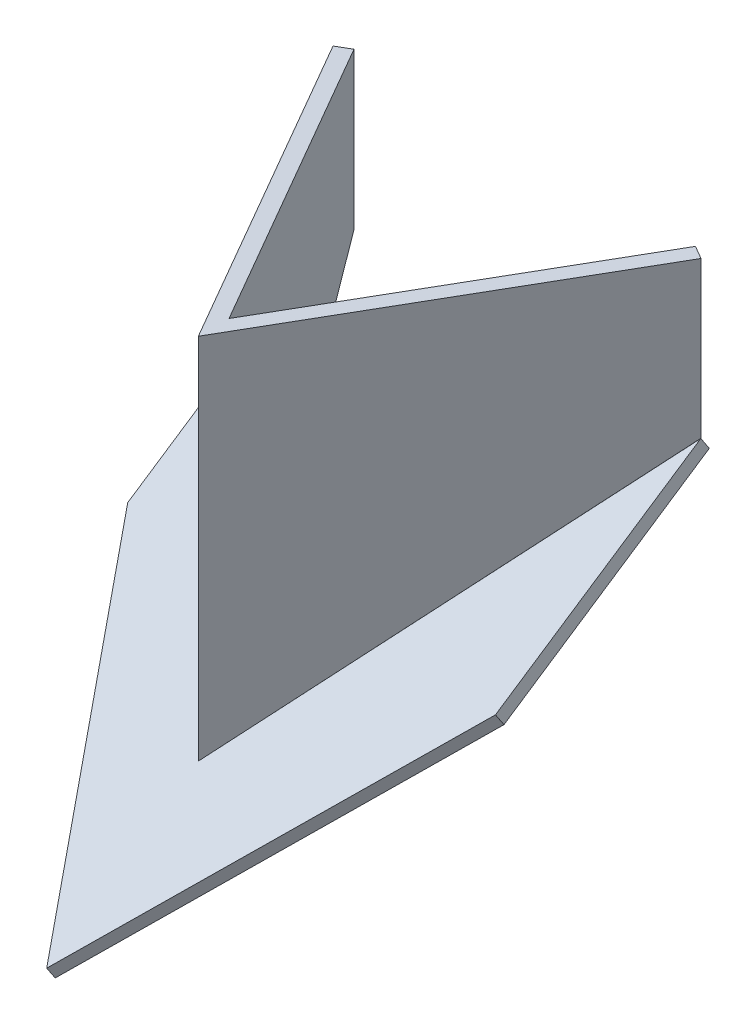
ISO-10303-21;
HEADER;
FILE_DESCRIPTION(('STEP AP214'),'2;1');
FILE_NAME('part.step','',(''),(''),'','','');
FILE_SCHEMA(('AUTOMOTIVE_DESIGN { 1 0 10303 214 1 1 1 1 }'));
ENDSEC;
DATA;
#1=APPLICATION_CONTEXT('core data for automotive mechanical design processes');
#2=APPLICATION_PROTOCOL_DEFINITION('international standard','automotive_design',2000,#1);
#3=PRODUCT_CONTEXT('',#1,'mechanical');
#4=PRODUCT('Part','Part','',(#3));
#5=PRODUCT_RELATED_PRODUCT_CATEGORY('part','',(#4));
#6=PRODUCT_DEFINITION_FORMATION('','',#4);
#7=PRODUCT_DEFINITION_CONTEXT('part definition',#1,'design');
#8=PRODUCT_DEFINITION('design','',#6,#7);
#9=PRODUCT_DEFINITION_SHAPE('','',#8);
#10=(LENGTH_UNIT() NAMED_UNIT(*) SI_UNIT(.MILLI.,.METRE.));
#11=(NAMED_UNIT(*) PLANE_ANGLE_UNIT() SI_UNIT($,.RADIAN.));
#12=(NAMED_UNIT(*) SI_UNIT($,.STERADIAN.) SOLID_ANGLE_UNIT());
#13=UNCERTAINTY_MEASURE_WITH_UNIT(LENGTH_MEASURE(1.E-05),#10,'distance_accuracy_value','');
#14=(GEOMETRIC_REPRESENTATION_CONTEXT(3) GLOBAL_UNCERTAINTY_ASSIGNED_CONTEXT((#13)) GLOBAL_UNIT_ASSIGNED_CONTEXT((#10,
#11,#12)) REPRESENTATION_CONTEXT('',''));
#15=CARTESIAN_POINT('',(0.,0.,0.));
#16=DIRECTION('',(0.,0.,1.));
#17=DIRECTION('',(1.,0.,0.));
#18=AXIS2_PLACEMENT_3D('',#15,#16,#17);
#19=CARTESIAN_POINT('',(0.00709387910028006,-5.28626521092144,-3.5182168490133));
#20=DIRECTION('',(0.901238732850657,-0.239243859388204,0.361290910700477));
#21=DIRECTION('',(0.372096782502334,0.,-0.928193936874946));
#22=AXIS2_PLACEMENT_3D('',#19,#20,#21);
#23=PLANE('',#22);
#24=DIRECTION('',(0.433321472343402,0.499734842352616,-0.749998392628246));
#25=VECTOR('',#24,1.);
#26=CARTESIAN_POINT('',(0.,0.,0.));
#27=LINE('',#26,#25);
#28=CARTESIAN_POINT('',(0.,0.,0.));
#29=VERTEX_POINT('',#28);
#30=CARTESIAN_POINT('',(76.1999999999997,87.8788553480485,-131.887942707306));
#31=VERTEX_POINT('',#30);
#32=EDGE_CURVE('E130',#29,#31,#27,.T.);
#33=ORIENTED_EDGE('',*,*,#32,.T.);
#34=DIRECTION('',(-0.00111714631500473,0.832482710381328,0.554049897482409));
#35=VECTOR('',#34,1.);
#36=CARTESIAN_POINT('',(76.2070938791,82.5925901371271,-135.406159556319));
#37=LINE('',#36,#35);
#38=CARTESIAN_POINT('',(76.2070938791,82.5925901371271,-135.406159556319));
#39=VERTEX_POINT('',#38);
#40=EDGE_CURVE('E12',#39,#31,#37,.T.);
#41=ORIENTED_EDGE('',*,*,#40,.F.);
#42=DIRECTION('',(0.433321472343402,0.499734842352616,-0.749998392628246));
#43=VECTOR('',#42,1.);
#44=CARTESIAN_POINT('',(0.00709387910028006,-5.28626521092144,-3.5182168490133));
#45=LINE('',#44,#43);
#46=CARTESIAN_POINT('',(0.00709387910028006,-5.28626521092144,-3.5182168490133));
#47=VERTEX_POINT('',#46);
#48=EDGE_CURVE('E142',#47,#39,#45,.T.);
#49=ORIENTED_EDGE('',*,*,#48,.F.);
#50=DIRECTION('',(-0.00111714631500473,0.832482710381328,0.554049897482409));
#51=VECTOR('',#50,1.);
#52=CARTESIAN_POINT('',(0.00709387910028006,-5.28626521092144,-3.5182168490133));
#53=LINE('',#52,#51);
#54=EDGE_CURVE('E126',#47,#29,#53,.T.);
#55=ORIENTED_EDGE('',*,*,#54,.T.);
#56=EDGE_LOOP('',(#33,#41,#49,#55));
#57=FACE_BOUND('',#56,.T.);
#58=ADVANCED_FACE('F47',(#57),#23,.F.);
#59=CARTESIAN_POINT('',(76.2070938791,82.5925901371271,-135.406159556319));
#60=DIRECTION('',(-0.999999375991861,-0.000930005572538701,-0.000618955187534298));
#61=DIRECTION('',(0.000930005750683888,-0.999999567544558,0.));
#62=AXIS2_PLACEMENT_3D('',#59,#60,#61);
#63=PLANE('',#62);
#64=DIRECTION('',(0.,-0.55405024321427,0.83248322985764));
#65=VECTOR('',#64,1.);
#66=CARTESIAN_POINT('',(76.1999999999997,87.8788553480485,-131.887942707306));
#67=LINE('',#66,#65);
#68=CARTESIAN_POINT('',(76.1999999999997,31.2852731012147,-46.8537626576136));
#69=VERTEX_POINT('',#68);
#70=EDGE_CURVE('E134',#31,#69,#67,.T.);
#71=ORIENTED_EDGE('',*,*,#70,.T.);
#72=DIRECTION('',(-0.00111714631500473,0.832482710381328,0.554049897482409));
#73=VECTOR('',#72,1.);
#74=CARTESIAN_POINT('',(76.2070938791,25.9990078902933,-50.3719795066269));
#75=LINE('',#74,#73);
#76=CARTESIAN_POINT('',(76.2070938791,25.9990078902933,-50.3719795066269));
#77=VERTEX_POINT('',#76);
#78=EDGE_CURVE('E55',#77,#69,#75,.T.);
#79=ORIENTED_EDGE('',*,*,#78,.F.);
#80=DIRECTION('',(0.,-0.55405024321427,0.83248322985764));
#81=VECTOR('',#80,1.);
#82=CARTESIAN_POINT('',(76.2070938791,82.5925901371271,-135.406159556319));
#83=LINE('',#82,#81);
#84=EDGE_CURVE('E96',#39,#77,#83,.T.);
#85=ORIENTED_EDGE('',*,*,#84,.F.);
#86=ORIENTED_EDGE('',*,*,#40,.T.);
#87=EDGE_LOOP('',(#71,#79,#85,#86));
#88=FACE_BOUND('',#87,.T.);
#89=ADVANCED_FACE('F166',(#88),#63,.F.);
#90=CARTESIAN_POINT('',(76.2070938791,25.9990078902933,-50.3719795066269));
#91=DIRECTION('',(-0.868703036801883,0.273631084700251,-0.412893525423868));
#92=DIRECTION('',(-0.429277002212649,0.,0.903172882327255));
#93=AXIS2_PLACEMENT_3D('',#90,#91,#92);
#94=PLANE('',#93);
#95=DIRECTION('',(-0.495331995569939,-0.481766090963157,0.722874572635379));
#96=VECTOR('',#95,1.);
#97=CARTESIAN_POINT('',(76.1999999999997,31.2852731012147,-46.8537626576136));
#98=LINE('',#97,#96);
#99=CARTESIAN_POINT('',(0.626923850211377,-42.2180454898893,63.4356101531636));
#100=VERTEX_POINT('',#99);
#101=EDGE_CURVE('E136',#69,#100,#98,.T.);
#102=ORIENTED_EDGE('',*,*,#101,.T.);
#103=DIRECTION('',(-0.00111714631500473,0.832482710381328,0.554049897482409));
#104=VECTOR('',#103,1.);
#105=CARTESIAN_POINT('',(0.634017729311657,-47.5043107008108,59.9173933041503));
#106=LINE('',#105,#104);
#107=CARTESIAN_POINT('',(0.634017729311657,-47.5043107008108,59.9173933041503));
#108=VERTEX_POINT('',#107);
#109=EDGE_CURVE('E122',#108,#100,#106,.T.);
#110=ORIENTED_EDGE('',*,*,#109,.F.);
#111=DIRECTION('',(-0.495331995569939,-0.481766090963157,0.722874572635379));
#112=VECTOR('',#111,1.);
#113=CARTESIAN_POINT('',(76.2070938791,25.9990078902933,-50.3719795066269));
#114=LINE('',#113,#112);
#115=EDGE_CURVE('E109',#77,#108,#114,.T.);
#116=ORIENTED_EDGE('',*,*,#115,.F.);
#117=ORIENTED_EDGE('',*,*,#78,.T.);
#118=EDGE_LOOP('',(#102,#110,#116,#117));
#119=FACE_BOUND('',#118,.T.);
#120=ADVANCED_FACE('F148',(#119),#94,.F.);
#121=CARTESIAN_POINT('',(0.634017729311657,-47.5043107008108,59.9173933041503));
#122=DIRECTION('',(0.865159259860783,0.278658740489786,-0.416951749517601));
#123=DIRECTION('',(-0.434148282934875,0.,-0.900841422462744));
#124=AXIS2_PLACEMENT_3D('',#121,#122,#123);
#125=PLANE('',#124);
#126=DIRECTION('',(-0.501495969137593,0.478875603121315,-0.720541428145491));
#127=VECTOR('',#126,1.);
#128=CARTESIAN_POINT('',(0.626923850211377,-42.2180454898893,63.4356101531636));
#129=LINE('',#128,#127);
#130=CARTESIAN_POINT('',(-76.2000000000007,31.1435401635173,-46.9480914870558));
#131=VERTEX_POINT('',#130);
#132=EDGE_CURVE('E118',#100,#131,#129,.T.);
#133=ORIENTED_EDGE('',*,*,#132,.T.);
#134=DIRECTION('',(-0.00111714631500473,0.832482710381328,0.554049897482409));
#135=VECTOR('',#134,1.);
#136=CARTESIAN_POINT('',(-76.1929061209004,25.8572749525959,-50.4663083360691));
#137=LINE('',#136,#135);
#138=CARTESIAN_POINT('',(-76.1929061209004,25.8572749525959,-50.4663083360691));
#139=VERTEX_POINT('',#138);
#140=EDGE_CURVE('E115',#139,#131,#137,.T.);
#141=ORIENTED_EDGE('',*,*,#140,.F.);
#142=DIRECTION('',(-0.501495969137593,0.478875603121315,-0.720541428145491));
#143=VECTOR('',#142,1.);
#144=CARTESIAN_POINT('',(0.634017729311657,-47.5043107008108,59.9173933041503));
#145=LINE('',#144,#143);
#146=EDGE_CURVE('E103',#108,#139,#145,.T.);
#147=ORIENTED_EDGE('',*,*,#146,.F.);
#148=ORIENTED_EDGE('',*,*,#109,.T.);
#149=EDGE_LOOP('',(#133,#141,#147,#148));
#150=FACE_BOUND('',#149,.T.);
#151=ADVANCED_FACE('F116',(#150),#125,.F.);
#152=CARTESIAN_POINT('',(-76.1929061209004,82.4508571994297,-135.500488385762));
#153=DIRECTION('',(-0.999999375991861,-0.000930005572538626,-0.000618955187534412));
#154=DIRECTION('',(0.000930005750683813,-0.999999567544558,0.));
#155=AXIS2_PLACEMENT_3D('',#152,#153,#154);
#156=PLANE('',#155);
#157=DIRECTION('',(0.,-0.55405024321427,0.83248322985764));
#158=VECTOR('',#157,1.);
#159=CARTESIAN_POINT('',(-76.2000000000007,87.7371224103511,-131.982271536748));
#160=LINE('',#159,#158);
#161=CARTESIAN_POINT('',(-76.2000000000007,87.7371224103511,-131.982271536748));
#162=VERTEX_POINT('',#161);
#163=EDGE_CURVE('E139',#162,#131,#160,.T.);
#164=ORIENTED_EDGE('',*,*,#163,.F.);
#165=DIRECTION('',(-0.00111714631500473,0.832482710381328,0.554049897482409));
#166=VECTOR('',#165,1.);
#167=CARTESIAN_POINT('',(-76.1929061209004,82.4508571994297,-135.500488385762));
#168=LINE('',#167,#166);
#169=CARTESIAN_POINT('',(-76.1929061209004,82.4508571994297,-135.500488385762));
#170=VERTEX_POINT('',#169);
#171=EDGE_CURVE('E85',#170,#162,#168,.T.);
#172=ORIENTED_EDGE('',*,*,#171,.F.);
#173=DIRECTION('',(0.,-0.55405024321427,0.83248322985764));
#174=VECTOR('',#173,1.);
#175=CARTESIAN_POINT('',(-76.1929061209004,82.4508571994297,-135.500488385762));
#176=LINE('',#175,#174);
#177=EDGE_CURVE('E107',#170,#139,#176,.T.);
#178=ORIENTED_EDGE('',*,*,#177,.T.);
#179=ORIENTED_EDGE('',*,*,#140,.T.);
#180=EDGE_LOOP('',(#164,#172,#178,#179));
#181=FACE_BOUND('',#180,.T.);
#182=ADVANCED_FACE('F124',(#181),#156,.T.);
#183=CARTESIAN_POINT('',(-76.1929061209004,82.4508571994297,-135.500488385762));
#184=DIRECTION('',(-0.901238732850654,-0.240920174521719,0.360175257226494));
#185=DIRECTION('',(0.37110621517362,0.,0.928590424815759));
#186=AXIS2_PLACEMENT_3D('',#183,#184,#185);
#187=PLANE('',#186);
#188=DIRECTION('',(0.433321472343407,-0.498928859081715,0.750534806109324));
#189=VECTOR('',#188,1.);
#190=CARTESIAN_POINT('',(-76.2000000000007,87.7371224103511,-131.982271536748));
#191=LINE('',#190,#189);
#192=EDGE_CURVE('E88',#162,#29,#191,.T.);
#193=ORIENTED_EDGE('',*,*,#192,.T.);
#194=ORIENTED_EDGE('',*,*,#54,.F.);
#195=DIRECTION('',(0.433321472343407,-0.498928859081715,0.750534806109324));
#196=VECTOR('',#195,1.);
#197=CARTESIAN_POINT('',(-76.1929061209004,82.4508571994297,-135.500488385762));
#198=LINE('',#197,#196);
#199=EDGE_CURVE('E63',#170,#47,#198,.T.);
#200=ORIENTED_EDGE('',*,*,#199,.F.);
#201=ORIENTED_EDGE('',*,*,#171,.T.);
#202=EDGE_LOOP('',(#193,#194,#200,#201));
#203=FACE_BOUND('',#202,.T.);
#204=ADVANCED_FACE('F155',(#203),#187,.F.);
#205=CARTESIAN_POINT('',(0.00709387910028007,-5.28626521092144,-3.5182168490133));
#206=DIRECTION('',(-0.00111714631500474,0.832482710381329,0.554049897482409));
#207=DIRECTION('',(0.,-0.55405024321427,0.83248322985764));
#208=AXIS2_PLACEMENT_3D('',#205,#206,#207);
#209=PLANE('',#208);
#210=ORIENTED_EDGE('',*,*,#48,.T.);
#211=ORIENTED_EDGE('',*,*,#84,.T.);
#212=ORIENTED_EDGE('',*,*,#115,.T.);
#213=ORIENTED_EDGE('',*,*,#146,.T.);
#214=ORIENTED_EDGE('',*,*,#177,.F.);
#215=ORIENTED_EDGE('',*,*,#199,.T.);
#216=EDGE_LOOP('',(#210,#211,#212,#213,#214,#215));
#217=FACE_BOUND('',#216,.T.);
#218=ADVANCED_FACE('F105',(#217),#209,.F.);
#219=CARTESIAN_POINT('',(0.,0.,0.));
#220=DIRECTION('',(-0.00111714631500474,0.832482710381329,0.554049897482409));
#221=DIRECTION('',(0.,-0.55405024321427,0.83248322985764));
#222=AXIS2_PLACEMENT_3D('',#219,#220,#221);
#223=PLANE('',#222);
#224=ORIENTED_EDGE('',*,*,#32,.F.);
#225=ORIENTED_EDGE('',*,*,#192,.F.);
#226=ORIENTED_EDGE('',*,*,#163,.T.);
#227=ORIENTED_EDGE('',*,*,#132,.F.);
#228=ORIENTED_EDGE('',*,*,#101,.F.);
#229=ORIENTED_EDGE('',*,*,#70,.F.);
#230=EDGE_LOOP('',(#224,#225,#226,#227,#228,#229));
#231=FACE_BOUND('',#230,.T.);
#232=ADVANCED_FACE('F151',(#231),#223,.T.);
#233=CLOSED_SHELL('',(#58,#89,#120,#151,#182,#204,#218,#232));
#234=MANIFOLD_SOLID_BREP('B2',#233);
#235=CARTESIAN_POINT('',(5.49926131403117,152.4,-3.17500000000003));
#236=DIRECTION('',(-0.866025403784436,0.,0.500000000000004));
#237=DIRECTION('',(0.500000000000004,0.,0.866025403784436));
#238=AXIS2_PLACEMENT_3D('',#235,#236,#237);
#239=PLANE('',#238);
#240=DIRECTION('',(0.480404005554627,-0.277214656517828,0.832084145780205));
#241=VECTOR('',#240,1.);
#242=CARTESIAN_POINT('',(-14.3740064244245,14.6410871785996,-37.5965094354242));
#243=LINE('',#242,#241);
#244=CARTESIAN_POINT('',(-0.0256971095831784,6.36146920636148,-12.7445086994055));
#245=VERTEX_POINT('',#244);
#246=CARTESIAN_POINT('',(0.,6.34664082165983,-12.7));
#247=VERTEX_POINT('',#246);
#248=EDGE_CURVE('E286',#245,#247,#243,.T.);
#249=ORIENTED_EDGE('',*,*,#248,.F.);
#250=DIRECTION('',(0.433321472343407,-0.498928859081716,0.750534806109324));
#251=VECTOR('',#250,1.);
#252=CARTESIAN_POINT('',(-27.4490986685032,37.9369329791064,-60.243233515818));
#253=LINE('',#252,#251);
#254=CARTESIAN_POINT('',(-70.7007386859695,87.7371224103512,-135.157271536748));
#255=VERTEX_POINT('',#254);
#256=EDGE_CURVE('E239',#255,#245,#253,.T.);
#257=ORIENTED_EDGE('',*,*,#256,.F.);
#258=DIRECTION('',(0.,-1.,0.));
#259=VECTOR('',#258,1.);
#260=CARTESIAN_POINT('',(-70.7007386859695,152.4,-135.157271536748));
#261=LINE('',#260,#259);
#262=CARTESIAN_POINT('',(-70.7007386859695,152.4,-135.157271536748));
#263=VERTEX_POINT('',#262);
#264=EDGE_CURVE('E232',#263,#255,#261,.T.);
#265=ORIENTED_EDGE('',*,*,#264,.F.);
#266=DIRECTION('',(-0.500000000000004,0.,-0.866025403784436));
#267=VECTOR('',#266,1.);
#268=CARTESIAN_POINT('',(5.49926131403117,152.4,-3.17500000000003));
#269=LINE('',#268,#267);
#270=CARTESIAN_POINT('',(0.,152.4,-12.7));
#271=VERTEX_POINT('',#270);
#272=EDGE_CURVE('E332',#271,#263,#269,.T.);
#273=ORIENTED_EDGE('',*,*,#272,.F.);
#274=DIRECTION('',(0.,-1.,0.));
#275=VECTOR('',#274,1.);
#276=CARTESIAN_POINT('',(0.,152.4,-12.7));
#277=LINE('',#276,#275);
#278=EDGE_CURVE('E305',#271,#247,#277,.T.);
#279=ORIENTED_EDGE('',*,*,#278,.T.);
#280=EDGE_LOOP('',(#249,#257,#265,#273,#279));
#281=FACE_BOUND('',#280,.T.);
#282=ADVANCED_FACE('F225',(#281),#239,.F.);
#283=CARTESIAN_POINT('',(0.,152.4,0.));
#284=DIRECTION('',(0.86602540378444,0.,0.499999999999998));
#285=DIRECTION('',(0.499999999999998,0.,-0.86602540378444));
#286=AXIS2_PLACEMENT_3D('',#283,#284,#285);
#287=PLANE('',#286);
#288=DIRECTION('',(0.,-1.,0.));
#289=VECTOR('',#288,1.);
#290=CARTESIAN_POINT('',(0.,152.4,0.));
#291=LINE('',#290,#289);
#292=CARTESIAN_POINT('',(0.,152.4,0.));
#293=VERTEX_POINT('',#292);
#294=CARTESIAN_POINT('',(0.,0.,0.));
#295=VERTEX_POINT('',#294);
#296=EDGE_CURVE('E307',#293,#295,#291,.T.);
#297=ORIENTED_EDGE('',*,*,#296,.T.);
#298=DIRECTION('',(0.433069964514898,0.499801583971332,-0.750099181771859));
#299=VECTOR('',#298,1.);
#300=CARTESIAN_POINT('',(32.9868358654071,38.0697673970544,-57.1348756998207));
#301=LINE('',#300,#299);
#302=CARTESIAN_POINT('',(76.1999999999997,87.9416348840445,-131.982271536749));
#303=VERTEX_POINT('',#302);
#304=EDGE_CURVE('E300',#295,#303,#301,.T.);
#305=ORIENTED_EDGE('',*,*,#304,.T.);
#306=DIRECTION('',(0.,-1.,0.));
#307=VECTOR('',#306,1.);
#308=CARTESIAN_POINT('',(76.1999999999997,152.4,-131.982271536749));
#309=LINE('',#308,#307);
#310=CARTESIAN_POINT('',(76.1999999999997,152.4,-131.982271536749));
#311=VERTEX_POINT('',#310);
#312=EDGE_CURVE('E299',#311,#303,#309,.T.);
#313=ORIENTED_EDGE('',*,*,#312,.F.);
#314=DIRECTION('',(-0.499999999999998,0.,0.86602540378444));
#315=VECTOR('',#314,1.);
#316=CARTESIAN_POINT('',(0.,152.4,0.));
#317=LINE('',#316,#315);
#318=EDGE_CURVE('E338',#311,#293,#317,.T.);
#319=ORIENTED_EDGE('',*,*,#318,.T.);
#320=EDGE_LOOP('',(#297,#305,#313,#319));
#321=FACE_BOUND('',#320,.T.);
#322=ADVANCED_FACE('F346',(#321),#287,.T.);
#323=CARTESIAN_POINT('',(70.7007386859685,152.4,-135.157271536749));
#324=DIRECTION('',(0.499999999999998,0.,-0.86602540378444));
#325=DIRECTION('',(-0.86602540378444,0.,-0.499999999999998));
#326=AXIS2_PLACEMENT_3D('',#323,#324,#325);
#327=PLANE('',#326);
#328=ORIENTED_EDGE('',*,*,#312,.T.);
#329=DIRECTION('',(0.86602540378444,0.,0.499999999999998));
#330=VECTOR('',#329,1.);
#331=CARTESIAN_POINT('',(-39.4748153285087,87.9416348840445,-198.767157305123));
#332=LINE('',#331,#330);
#333=CARTESIAN_POINT('',(70.7007386859685,87.9416348840445,-135.157271536749));
#334=VERTEX_POINT('',#333);
#335=EDGE_CURVE('E284',#334,#303,#332,.T.);
#336=ORIENTED_EDGE('',*,*,#335,.F.);
#337=DIRECTION('',(0.,-1.,0.));
#338=VECTOR('',#337,1.);
#339=CARTESIAN_POINT('',(70.7007386859685,152.4,-135.157271536749));
#340=LINE('',#339,#338);
#341=CARTESIAN_POINT('',(70.7007386859685,152.4,-135.157271536749));
#342=VERTEX_POINT('',#341);
#343=EDGE_CURVE('E297',#342,#334,#340,.T.);
#344=ORIENTED_EDGE('',*,*,#343,.F.);
#345=DIRECTION('',(0.86602540378444,0.,0.499999999999998));
#346=VECTOR('',#345,1.);
#347=CARTESIAN_POINT('',(70.7007386859685,152.4,-135.157271536749));
#348=LINE('',#347,#346);
#349=EDGE_CURVE('E341',#342,#311,#348,.T.);
#350=ORIENTED_EDGE('',*,*,#349,.T.);
#351=EDGE_LOOP('',(#328,#336,#344,#350));
#352=FACE_BOUND('',#351,.T.);
#353=ADVANCED_FACE('F295',(#352),#327,.T.);
#354=CARTESIAN_POINT('',(-5.49926131403119,152.4,-3.17499999999999));
#355=DIRECTION('',(0.86602540378444,0.,0.499999999999998));
#356=DIRECTION('',(0.499999999999998,0.,-0.86602540378444));
#357=AXIS2_PLACEMENT_3D('',#354,#355,#356);
#358=PLANE('',#357);
#359=DIRECTION('',(0.433069964514899,0.499801583971332,-0.750099181771859));
#360=VECTOR('',#359,1.);
#361=CARTESIAN_POINT('',(27.4875745513759,38.0697673970544,-60.3098756998207));
#362=LINE('',#361,#360);
#363=EDGE_CURVE('E281',#247,#334,#362,.T.);
#364=ORIENTED_EDGE('',*,*,#363,.F.);
#365=ORIENTED_EDGE('',*,*,#278,.F.);
#366=DIRECTION('',(-0.499999999999998,0.,0.86602540378444));
#367=VECTOR('',#366,1.);
#368=CARTESIAN_POINT('',(-5.49926131403119,152.4,-3.17499999999999));
#369=LINE('',#368,#367);
#370=EDGE_CURVE('E303',#342,#271,#369,.T.);
#371=ORIENTED_EDGE('',*,*,#370,.F.);
#372=ORIENTED_EDGE('',*,*,#343,.T.);
#373=EDGE_LOOP('',(#364,#365,#371,#372));
#374=FACE_BOUND('',#373,.T.);
#375=ADVANCED_FACE('F302',(#374),#358,.F.);
#376=CARTESIAN_POINT('',(-282.269406228435,0.,162.968317669985));
#377=DIRECTION('',(-0.24946442954086,-0.866642944686805,-0.432085066645951));
#378=DIRECTION('',(0.,0.446191886150516,-0.894937316650415));
#379=AXIS2_PLACEMENT_3D('',#376,#377,#378);
#380=PLANE('',#379);
#381=ORIENTED_EDGE('',*,*,#256,.T.);
#382=DIRECTION('',(0.00180406591212769,-0.446607028277284,0.894728398811347));
#383=VECTOR('',#382,1.);
#384=CARTESIAN_POINT('',(0.262136458598572,-64.8934077135768,130.0068541262));
#385=LINE('',#384,#383);
#386=EDGE_CURVE('E45',#245,#295,#385,.T.);
#387=ORIENTED_EDGE('',*,*,#386,.T.);
#388=DIRECTION('',(0.433321472343407,-0.498928859081716,0.750534806109324));
#389=VECTOR('',#388,1.);
#390=CARTESIAN_POINT('',(-32.9483599825343,37.9369329791063,-57.068233515818));
#391=LINE('',#390,#389);
#392=CARTESIAN_POINT('',(-76.2000000000007,87.7371224103512,-131.982271536748));
#393=VERTEX_POINT('',#392);
#394=EDGE_CURVE('E326',#393,#295,#391,.T.);
#395=ORIENTED_EDGE('',*,*,#394,.F.);
#396=DIRECTION('',(0.866025403784436,0.,-0.500000000000005));
#397=VECTOR('',#396,1.);
#398=CARTESIAN_POINT('',(-358.469406228436,87.7371224103512,30.9860461332367));
#399=LINE('',#398,#397);
#400=EDGE_CURVE('E246',#393,#255,#399,.T.);
#401=ORIENTED_EDGE('',*,*,#400,.T.);
#402=EDGE_LOOP('',(#381,#387,#395,#401));
#403=FACE_BOUND('',#402,.T.);
#404=ADVANCED_FACE('F324',(#403),#380,.T.);
#405=CARTESIAN_POINT('',(-76.2000000000007,152.4,-131.982271536748));
#406=DIRECTION('',(-0.500000000000006,0.,-0.866025403784435));
#407=DIRECTION('',(-0.866025403784435,0.,0.500000000000006));
#408=AXIS2_PLACEMENT_3D('',#405,#406,#407);
#409=PLANE('',#408);
#410=ORIENTED_EDGE('',*,*,#264,.T.);
#411=ORIENTED_EDGE('',*,*,#400,.F.);
#412=DIRECTION('',(0.,-1.,0.));
#413=VECTOR('',#412,1.);
#414=CARTESIAN_POINT('',(-76.2000000000007,152.4,-131.982271536748));
#415=LINE('',#414,#413);
#416=CARTESIAN_POINT('',(-76.2000000000007,152.4,-131.982271536748));
#417=VERTEX_POINT('',#416);
#418=EDGE_CURVE('E316',#417,#393,#415,.T.);
#419=ORIENTED_EDGE('',*,*,#418,.F.);
#420=DIRECTION('',(0.866025403784435,0.,-0.500000000000006));
#421=VECTOR('',#420,1.);
#422=CARTESIAN_POINT('',(-76.2000000000007,152.4,-131.982271536748));
#423=LINE('',#422,#421);
#424=EDGE_CURVE('E320',#417,#263,#423,.T.);
#425=ORIENTED_EDGE('',*,*,#424,.T.);
#426=EDGE_LOOP('',(#410,#411,#419,#425));
#427=FACE_BOUND('',#426,.T.);
#428=ADVANCED_FACE('F318',(#427),#409,.T.);
#429=CARTESIAN_POINT('',(0.,152.4,0.));
#430=DIRECTION('',(-0.866025403784436,0.,0.500000000000004));
#431=DIRECTION('',(0.500000000000004,0.,0.866025403784436));
#432=AXIS2_PLACEMENT_3D('',#429,#430,#431);
#433=PLANE('',#432);
#434=ORIENTED_EDGE('',*,*,#418,.T.);
#435=ORIENTED_EDGE('',*,*,#394,.T.);
#436=ORIENTED_EDGE('',*,*,#296,.F.);
#437=DIRECTION('',(-0.500000000000004,0.,-0.866025403784436));
#438=VECTOR('',#437,1.);
#439=CARTESIAN_POINT('',(0.,152.4,0.));
#440=LINE('',#439,#438);
#441=EDGE_CURVE('E335',#293,#417,#440,.T.);
#442=ORIENTED_EDGE('',*,*,#441,.T.);
#443=EDGE_LOOP('',(#434,#435,#436,#442));
#444=FACE_BOUND('',#443,.T.);
#445=ADVANCED_FACE('F358',(#444),#433,.T.);
#446=CARTESIAN_POINT('',(0.,152.4,0.));
#447=DIRECTION('',(0.,-1.,0.));
#448=DIRECTION('',(-1.,0.,0.));
#449=AXIS2_PLACEMENT_3D('',#446,#447,#448);
#450=PLANE('',#449);
#451=ORIENTED_EDGE('',*,*,#272,.T.);
#452=ORIENTED_EDGE('',*,*,#424,.F.);
#453=ORIENTED_EDGE('',*,*,#441,.F.);
#454=ORIENTED_EDGE('',*,*,#318,.F.);
#455=ORIENTED_EDGE('',*,*,#349,.F.);
#456=ORIENTED_EDGE('',*,*,#370,.T.);
#457=EDGE_LOOP('',(#451,#452,#453,#454,#455,#456));
#458=FACE_BOUND('',#457,.T.);
#459=ADVANCED_FACE('F343',(#458),#450,.F.);
#460=CARTESIAN_POINT('',(-115.674815328508,0.,-66.7848857683742));
#461=DIRECTION('',(0.249900791985665,-0.8661399290298,-0.432840868570875));
#462=DIRECTION('',(0.,0.447024303073413,-0.89452181217773));
#463=AXIS2_PLACEMENT_3D('',#460,#461,#462);
#464=PLANE('',#463);
#465=ORIENTED_EDGE('',*,*,#363,.T.);
#466=ORIENTED_EDGE('',*,*,#335,.T.);
#467=ORIENTED_EDGE('',*,*,#304,.F.);
#468=ORIENTED_EDGE('',*,*,#386,.F.);
#469=ORIENTED_EDGE('',*,*,#248,.T.);
#470=EDGE_LOOP('',(#465,#466,#467,#468,#469));
#471=FACE_BOUND('',#470,.T.);
#472=ADVANCED_FACE('F283',(#471),#464,.T.);
#473=CLOSED_SHELL('',(#282,#322,#353,#375,#404,#428,#445,#459,#472));
#474=MANIFOLD_SOLID_BREP('B6',#473);
#475=ADVANCED_BREP_SHAPE_REPRESENTATION('',(#18,#234,#474),#14);
#476=SHAPE_DEFINITION_REPRESENTATION(#9,#475);
ENDSEC;
END-ISO-10303-21;
